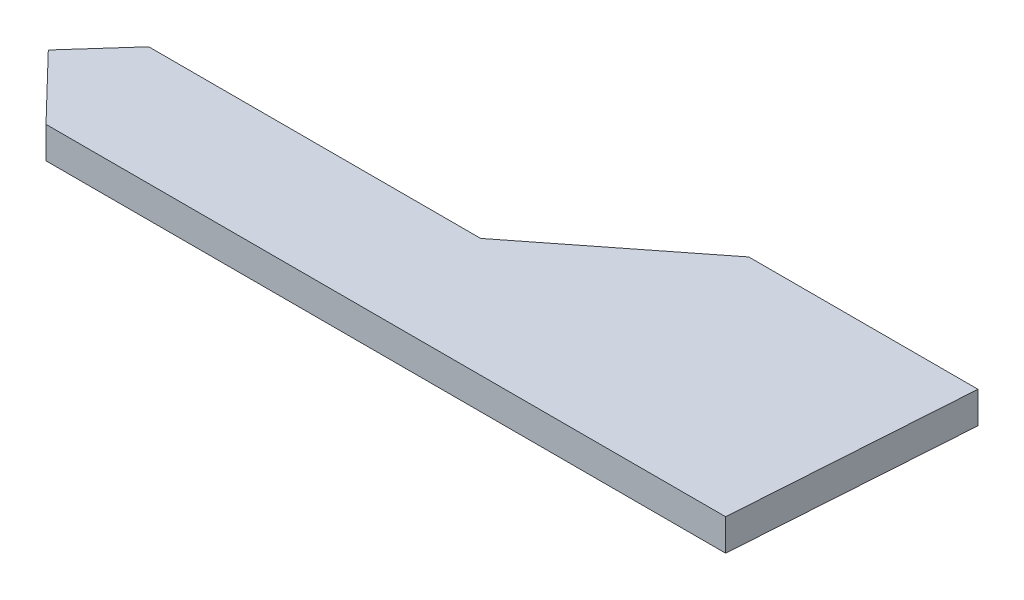
ISO-10303-21;
HEADER;
FILE_DESCRIPTION(('STEP AP214'),'2;1');
FILE_NAME('part.step','',(''),(''),'','','');
FILE_SCHEMA(('AUTOMOTIVE_DESIGN { 1 0 10303 214 1 1 1 1 }'));
ENDSEC;
DATA;
#1=APPLICATION_CONTEXT('core data for automotive mechanical design processes');
#2=APPLICATION_PROTOCOL_DEFINITION('international standard','automotive_design',2000,#1);
#3=PRODUCT_CONTEXT('',#1,'mechanical');
#4=PRODUCT('Part','Part','',(#3));
#5=PRODUCT_RELATED_PRODUCT_CATEGORY('part','',(#4));
#6=PRODUCT_DEFINITION_FORMATION('','',#4);
#7=PRODUCT_DEFINITION_CONTEXT('part definition',#1,'design');
#8=PRODUCT_DEFINITION('design','',#6,#7);
#9=PRODUCT_DEFINITION_SHAPE('','',#8);
#10=(LENGTH_UNIT() NAMED_UNIT(*) SI_UNIT(.MILLI.,.METRE.));
#11=(NAMED_UNIT(*) PLANE_ANGLE_UNIT() SI_UNIT($,.RADIAN.));
#12=(NAMED_UNIT(*) SI_UNIT($,.STERADIAN.) SOLID_ANGLE_UNIT());
#13=UNCERTAINTY_MEASURE_WITH_UNIT(LENGTH_MEASURE(1.E-05),#10,'distance_accuracy_value','');
#14=(GEOMETRIC_REPRESENTATION_CONTEXT(3) GLOBAL_UNCERTAINTY_ASSIGNED_CONTEXT((#13)) GLOBAL_UNIT_ASSIGNED_CONTEXT((#10,
#11,#12)) REPRESENTATION_CONTEXT('',''));
#15=CARTESIAN_POINT('',(0.,0.,0.));
#16=DIRECTION('',(0.,0.,1.));
#17=DIRECTION('',(1.,0.,0.));
#18=AXIS2_PLACEMENT_3D('',#15,#16,#17);
#19=CARTESIAN_POINT('',(-16.7698744769875,2.,5.77355803319529));
#20=DIRECTION('',(0.71965607764879,0.,-0.694330706438336));
#21=DIRECTION('',(-0.694330706438336,0.,-0.71965607764879));
#22=AXIS2_PLACEMENT_3D('',#19,#20,#21);
#23=PLANE('',#22);
#24=DIRECTION('',(0.694330706438336,0.,0.71965607764879));
#25=VECTOR('',#24,1.);
#26=CARTESIAN_POINT('',(-16.7698744769875,0.,5.77355803319529));
#27=LINE('',#26,#25);
#28=CARTESIAN_POINT('',(-16.7698744769875,0.,5.77355803319529));
#29=VERTEX_POINT('',#28);
#30=CARTESIAN_POINT('',(-12.7698744769875,0.,9.9194560669456));
#31=VERTEX_POINT('',#30);
#32=EDGE_CURVE('E125',#29,#31,#27,.T.);
#33=ORIENTED_EDGE('',*,*,#32,.T.);
#34=DIRECTION('',(0.,-1.,0.));
#35=VECTOR('',#34,1.);
#36=CARTESIAN_POINT('',(-12.7698744769875,2.,9.9194560669456));
#37=LINE('',#36,#35);
#38=CARTESIAN_POINT('',(-12.7698744769875,2.,9.9194560669456));
#39=VERTEX_POINT('',#38);
#40=EDGE_CURVE('E11',#39,#31,#37,.T.);
#41=ORIENTED_EDGE('',*,*,#40,.F.);
#42=DIRECTION('',(0.694330706438336,0.,0.71965607764879));
#43=VECTOR('',#42,1.);
#44=CARTESIAN_POINT('',(-16.7698744769875,2.,5.77355803319529));
#45=LINE('',#44,#43);
#46=CARTESIAN_POINT('',(-16.7698744769875,2.,5.77355803319529));
#47=VERTEX_POINT('',#46);
#48=EDGE_CURVE('E137',#47,#39,#45,.T.);
#49=ORIENTED_EDGE('',*,*,#48,.F.);
#50=DIRECTION('',(0.,-1.,0.));
#51=VECTOR('',#50,1.);
#52=CARTESIAN_POINT('',(-16.7698744769875,2.,5.77355803319529));
#53=LINE('',#52,#51);
#54=EDGE_CURVE('E121',#47,#29,#53,.T.);
#55=ORIENTED_EDGE('',*,*,#54,.T.);
#56=EDGE_LOOP('',(#33,#41,#49,#55));
#57=FACE_BOUND('',#56,.T.);
#58=ADVANCED_FACE('F35',(#57),#23,.F.);
#59=CARTESIAN_POINT('',(-12.7698744769875,2.,9.9194560669456));
#60=DIRECTION('',(0.,0.,-1.));
#61=DIRECTION('',(-1.,0.,0.));
#62=AXIS2_PLACEMENT_3D('',#59,#60,#61);
#63=PLANE('',#62);
#64=DIRECTION('',(1.,0.,0.));
#65=VECTOR('',#64,1.);
#66=CARTESIAN_POINT('',(-12.7698744769875,0.,9.9194560669456));
#67=LINE('',#66,#65);
#68=CARTESIAN_POINT('',(30.2301255230125,0.,9.9194560669456));
#69=VERTEX_POINT('',#68);
#70=EDGE_CURVE('E128',#31,#69,#67,.T.);
#71=ORIENTED_EDGE('',*,*,#70,.T.);
#72=DIRECTION('',(0.,-1.,0.));
#73=VECTOR('',#72,1.);
#74=CARTESIAN_POINT('',(30.2301255230125,2.,9.9194560669456));
#75=LINE('',#74,#73);
#76=CARTESIAN_POINT('',(30.2301255230125,2.,9.9194560669456));
#77=VERTEX_POINT('',#76);
#78=EDGE_CURVE('E43',#77,#69,#75,.T.);
#79=ORIENTED_EDGE('',*,*,#78,.F.);
#80=DIRECTION('',(1.,0.,0.));
#81=VECTOR('',#80,1.);
#82=CARTESIAN_POINT('',(-12.7698744769875,2.,9.9194560669456));
#83=LINE('',#82,#81);
#84=EDGE_CURVE('E91',#39,#77,#83,.T.);
#85=ORIENTED_EDGE('',*,*,#84,.F.);
#86=ORIENTED_EDGE('',*,*,#40,.T.);
#87=EDGE_LOOP('',(#71,#79,#85,#86));
#88=FACE_BOUND('',#87,.T.);
#89=ADVANCED_FACE('F162',(#88),#63,.F.);
#90=CARTESIAN_POINT('',(30.2301255230125,2.,9.9194560669456));
#91=DIRECTION('',(-0.997775303139718,0.,-0.0666666666666667));
#92=DIRECTION('',(-0.0666666666666667,0.,0.997775303139718));
#93=AXIS2_PLACEMENT_3D('',#90,#91,#92);
#94=PLANE('',#93);
#95=DIRECTION('',(0.0666666666666667,0.,-0.997775303139718));
#96=VECTOR('',#95,1.);
#97=CARTESIAN_POINT('',(30.2301255230125,0.,9.9194560669456));
#98=LINE('',#97,#96);
#99=CARTESIAN_POINT('',(31.2301255230125,0.,-5.04717348015016));
#100=VERTEX_POINT('',#99);
#101=EDGE_CURVE('E130',#69,#100,#98,.T.);
#102=ORIENTED_EDGE('',*,*,#101,.T.);
#103=DIRECTION('',(0.,-1.,0.));
#104=VECTOR('',#103,1.);
#105=CARTESIAN_POINT('',(31.2301255230125,2.,-5.04717348015016));
#106=LINE('',#105,#104);
#107=CARTESIAN_POINT('',(31.2301255230125,2.,-5.04717348015016));
#108=VERTEX_POINT('',#107);
#109=EDGE_CURVE('E141',#108,#100,#106,.T.);
#110=ORIENTED_EDGE('',*,*,#109,.F.);
#111=DIRECTION('',(0.0666666666666667,0.,-0.997775303139718));
#112=VECTOR('',#111,1.);
#113=CARTESIAN_POINT('',(30.2301255230125,2.,9.9194560669456));
#114=LINE('',#113,#112);
#115=EDGE_CURVE('E149',#77,#108,#114,.T.);
#116=ORIENTED_EDGE('',*,*,#115,.F.);
#117=ORIENTED_EDGE('',*,*,#78,.T.);
#118=EDGE_LOOP('',(#102,#110,#116,#117));
#119=FACE_BOUND('',#118,.T.);
#120=ADVANCED_FACE('F147',(#119),#94,.F.);
#121=CARTESIAN_POINT('',(31.2301255230125,2.,-5.04717348015016));
#122=DIRECTION('',(0.,0.,1.));
#123=DIRECTION('',(1.,0.,0.));
#124=AXIS2_PLACEMENT_3D('',#121,#122,#123);
#125=PLANE('',#124);
#126=DIRECTION('',(-1.,0.,0.));
#127=VECTOR('',#126,1.);
#128=CARTESIAN_POINT('',(31.2301255230125,0.,-5.04717348015016));
#129=LINE('',#128,#127);
#130=CARTESIAN_POINT('',(16.7301255230125,0.,-5.04717348015016));
#131=VERTEX_POINT('',#130);
#132=EDGE_CURVE('E132',#100,#131,#129,.T.);
#133=ORIENTED_EDGE('',*,*,#132,.T.);
#134=DIRECTION('',(0.,-1.,0.));
#135=VECTOR('',#134,1.);
#136=CARTESIAN_POINT('',(16.7301255230125,2.,-5.04717348015016));
#137=LINE('',#136,#135);
#138=CARTESIAN_POINT('',(16.7301255230125,2.,-5.04717348015016));
#139=VERTEX_POINT('',#138);
#140=EDGE_CURVE('E116',#139,#131,#137,.T.);
#141=ORIENTED_EDGE('',*,*,#140,.F.);
#142=DIRECTION('',(-1.,0.,0.));
#143=VECTOR('',#142,1.);
#144=CARTESIAN_POINT('',(31.2301255230125,2.,-5.04717348015016));
#145=LINE('',#144,#143);
#146=EDGE_CURVE('E107',#108,#139,#145,.T.);
#147=ORIENTED_EDGE('',*,*,#146,.F.);
#148=ORIENTED_EDGE('',*,*,#109,.T.);
#149=EDGE_LOOP('',(#133,#141,#147,#148));
#150=FACE_BOUND('',#149,.T.);
#151=ADVANCED_FACE('F155',(#150),#125,.F.);
#152=CARTESIAN_POINT('',(16.7301255230125,2.,-5.04717348015016));
#153=DIRECTION('',(0.617941479812345,0.,0.786224094980133));
#154=DIRECTION('',(0.786224094980133,0.,-0.617941479812346));
#155=AXIS2_PLACEMENT_3D('',#152,#153,#154);
#156=PLANE('',#155);
#157=DIRECTION('',(-0.786224094980133,0.,0.617941479812345));
#158=VECTOR('',#157,1.);
#159=CARTESIAN_POINT('',(16.7301255230125,0.,-5.04717348015016));
#160=LINE('',#159,#158);
#161=CARTESIAN_POINT('',(7.23012552301255,0.,2.4194560669456));
#162=VERTEX_POINT('',#161);
#163=EDGE_CURVE('E115',#131,#162,#160,.T.);
#164=ORIENTED_EDGE('',*,*,#163,.T.);
#165=DIRECTION('',(0.,-1.,0.));
#166=VECTOR('',#165,1.);
#167=CARTESIAN_POINT('',(7.23012552301255,2.,2.4194560669456));
#168=LINE('',#167,#166);
#169=CARTESIAN_POINT('',(7.23012552301255,2.,2.4194560669456));
#170=VERTEX_POINT('',#169);
#171=EDGE_CURVE('E112',#170,#162,#168,.T.);
#172=ORIENTED_EDGE('',*,*,#171,.F.);
#173=DIRECTION('',(-0.786224094980133,0.,0.617941479812345));
#174=VECTOR('',#173,1.);
#175=CARTESIAN_POINT('',(16.7301255230125,2.,-5.04717348015016));
#176=LINE('',#175,#174);
#177=EDGE_CURVE('E101',#139,#170,#176,.T.);
#178=ORIENTED_EDGE('',*,*,#177,.F.);
#179=ORIENTED_EDGE('',*,*,#140,.T.);
#180=EDGE_LOOP('',(#164,#172,#178,#179));
#181=FACE_BOUND('',#180,.T.);
#182=ADVANCED_FACE('F113',(#181),#156,.F.);
#183=CARTESIAN_POINT('',(7.23012552301255,2.,2.4194560669456));
#184=DIRECTION('',(0.,0.,1.));
#185=DIRECTION('',(1.,0.,0.));
#186=AXIS2_PLACEMENT_3D('',#183,#184,#185);
#187=PLANE('',#186);
#188=DIRECTION('',(-1.,0.,0.));
#189=VECTOR('',#188,1.);
#190=CARTESIAN_POINT('',(7.23012552301255,0.,2.4194560669456));
#191=LINE('',#190,#189);
#192=CARTESIAN_POINT('',(-13.7698744769875,0.,2.4194560669456));
#193=VERTEX_POINT('',#192);
#194=EDGE_CURVE('E77',#162,#193,#191,.T.);
#195=ORIENTED_EDGE('',*,*,#194,.T.);
#196=DIRECTION('',(0.,-1.,0.));
#197=VECTOR('',#196,1.);
#198=CARTESIAN_POINT('',(-13.7698744769875,2.,2.4194560669456));
#199=LINE('',#198,#197);
#200=CARTESIAN_POINT('',(-13.7698744769875,2.,2.4194560669456));
#201=VERTEX_POINT('',#200);
#202=EDGE_CURVE('E117',#201,#193,#199,.T.);
#203=ORIENTED_EDGE('',*,*,#202,.F.);
#204=DIRECTION('',(-1.,0.,0.));
#205=VECTOR('',#204,1.);
#206=CARTESIAN_POINT('',(7.23012552301255,2.,2.4194560669456));
#207=LINE('',#206,#205);
#208=EDGE_CURVE('E105',#170,#201,#207,.T.);
#209=ORIENTED_EDGE('',*,*,#208,.F.);
#210=ORIENTED_EDGE('',*,*,#171,.T.);
#211=EDGE_LOOP('',(#195,#203,#209,#210));
#212=FACE_BOUND('',#211,.T.);
#213=ADVANCED_FACE('F119',(#212),#187,.F.);
#214=CARTESIAN_POINT('',(-13.7698744769875,2.,2.4194560669456));
#215=DIRECTION('',(0.74535599249993,0.,0.666666666666667));
#216=DIRECTION('',(0.666666666666667,0.,-0.74535599249993));
#217=AXIS2_PLACEMENT_3D('',#214,#215,#216);
#218=PLANE('',#217);
#219=DIRECTION('',(-0.666666666666667,0.,0.74535599249993));
#220=VECTOR('',#219,1.);
#221=CARTESIAN_POINT('',(-13.7698744769875,0.,2.4194560669456));
#222=LINE('',#221,#220);
#223=EDGE_CURVE('E83',#193,#29,#222,.T.);
#224=ORIENTED_EDGE('',*,*,#223,.T.);
#225=ORIENTED_EDGE('',*,*,#54,.F.);
#226=DIRECTION('',(-0.666666666666667,0.,0.74535599249993));
#227=VECTOR('',#226,1.);
#228=CARTESIAN_POINT('',(-13.7698744769875,2.,2.4194560669456));
#229=LINE('',#228,#227);
#230=EDGE_CURVE('E51',#201,#47,#229,.T.);
#231=ORIENTED_EDGE('',*,*,#230,.F.);
#232=ORIENTED_EDGE('',*,*,#202,.T.);
#233=EDGE_LOOP('',(#224,#225,#231,#232));
#234=FACE_BOUND('',#233,.T.);
#235=ADVANCED_FACE('F176',(#234),#218,.F.);
#236=CARTESIAN_POINT('',(0.,2.,0.));
#237=DIRECTION('',(0.,-1.,0.));
#238=DIRECTION('',(0.,0.,-1.));
#239=AXIS2_PLACEMENT_3D('',#236,#237,#238);
#240=PLANE('',#239);
#241=ORIENTED_EDGE('',*,*,#48,.T.);
#242=ORIENTED_EDGE('',*,*,#84,.T.);
#243=ORIENTED_EDGE('',*,*,#115,.T.);
#244=ORIENTED_EDGE('',*,*,#146,.T.);
#245=ORIENTED_EDGE('',*,*,#177,.T.);
#246=ORIENTED_EDGE('',*,*,#208,.T.);
#247=ORIENTED_EDGE('',*,*,#230,.T.);
#248=EDGE_LOOP('',(#241,#242,#243,#244,#245,#246,#247));
#249=FACE_BOUND('',#248,.T.);
#250=ADVANCED_FACE('F103',(#249),#240,.F.);
#251=CARTESIAN_POINT('',(0.,0.,0.));
#252=DIRECTION('',(0.,-1.,0.));
#253=DIRECTION('',(0.,0.,-1.));
#254=AXIS2_PLACEMENT_3D('',#251,#252,#253);
#255=PLANE('',#254);
#256=ORIENTED_EDGE('',*,*,#32,.F.);
#257=ORIENTED_EDGE('',*,*,#223,.F.);
#258=ORIENTED_EDGE('',*,*,#194,.F.);
#259=ORIENTED_EDGE('',*,*,#163,.F.);
#260=ORIENTED_EDGE('',*,*,#132,.F.);
#261=ORIENTED_EDGE('',*,*,#101,.F.);
#262=ORIENTED_EDGE('',*,*,#70,.F.);
#263=EDGE_LOOP('',(#256,#257,#258,#259,#260,#261,#262));
#264=FACE_BOUND('',#263,.T.);
#265=ADVANCED_FACE('F153',(#264),#255,.T.);
#266=CLOSED_SHELL('',(#58,#89,#120,#151,#182,#213,#235,#250,#265));
#267=MANIFOLD_SOLID_BREP('B2',#266);
#268=ADVANCED_BREP_SHAPE_REPRESENTATION('',(#18,#267),#14);
#269=SHAPE_DEFINITION_REPRESENTATION(#9,#268);
ENDSEC;
END-ISO-10303-21;
